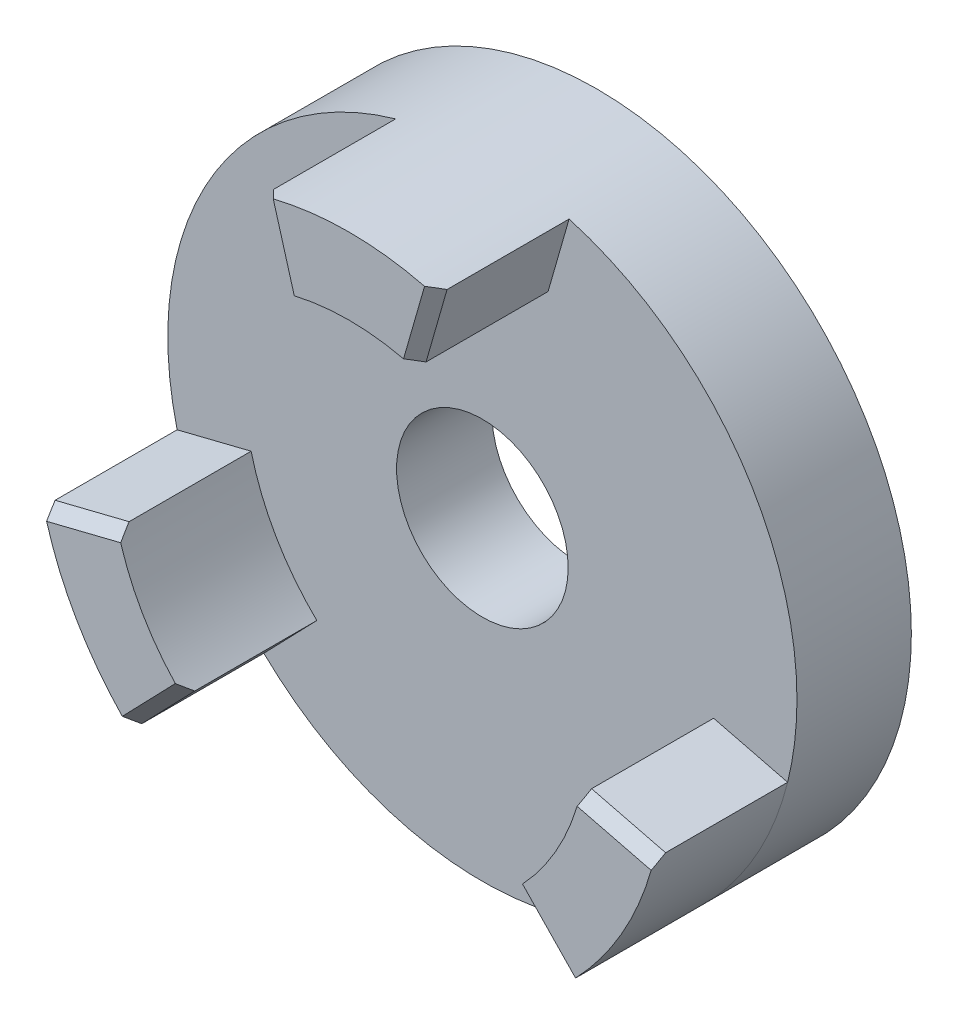
ISO-10303-21;
HEADER;
FILE_DESCRIPTION(('STEP AP214'),'2;1');
FILE_NAME('part.step','',(''),(''),'','','');
FILE_SCHEMA(('AUTOMOTIVE_DESIGN { 1 0 10303 214 1 1 1 1 }'));
ENDSEC;
DATA;
#1=APPLICATION_CONTEXT('core data for automotive mechanical design processes');
#2=APPLICATION_PROTOCOL_DEFINITION('international standard','automotive_design',2000,#1);
#3=PRODUCT_CONTEXT('',#1,'mechanical');
#4=PRODUCT('Part','Part','',(#3));
#5=PRODUCT_RELATED_PRODUCT_CATEGORY('part','',(#4));
#6=PRODUCT_DEFINITION_FORMATION('','',#4);
#7=PRODUCT_DEFINITION_CONTEXT('part definition',#1,'design');
#8=PRODUCT_DEFINITION('design','',#6,#7);
#9=PRODUCT_DEFINITION_SHAPE('','',#8);
#10=(LENGTH_UNIT() NAMED_UNIT(*) SI_UNIT(.MILLI.,.METRE.));
#11=(NAMED_UNIT(*) PLANE_ANGLE_UNIT() SI_UNIT($,.RADIAN.));
#12=(NAMED_UNIT(*) SI_UNIT($,.STERADIAN.) SOLID_ANGLE_UNIT());
#13=UNCERTAINTY_MEASURE_WITH_UNIT(LENGTH_MEASURE(1.E-05),#10,'distance_accuracy_value','');
#14=(GEOMETRIC_REPRESENTATION_CONTEXT(3) GLOBAL_UNCERTAINTY_ASSIGNED_CONTEXT((#13)) GLOBAL_UNIT_ASSIGNED_CONTEXT((#10,
#11,#12)) REPRESENTATION_CONTEXT('',''));
#15=CARTESIAN_POINT('',(0.,0.,0.));
#16=DIRECTION('',(0.,0.,1.));
#17=DIRECTION('',(1.,0.,0.));
#18=AXIS2_PLACEMENT_3D('',#15,#16,#17);
#19=CARTESIAN_POINT('',(0.,0.,1.));
#20=DIRECTION('',(0.,0.,1.));
#21=DIRECTION('',(1.,0.,0.));
#22=AXIS2_PLACEMENT_3D('',#19,#20,#21);
#23=PLANE('',#22);
#24=CARTESIAN_POINT('',(0.,0.,1.));
#25=DIRECTION('',(0.,0.,1.));
#26=DIRECTION('',(1.,0.,0.));
#27=AXIS2_PLACEMENT_3D('',#24,#25,#26);
#28=CIRCLE('',#27,4.5);
#29=CARTESIAN_POINT('',(4.5,0.,1.));
#30=VERTEX_POINT('',#29);
#31=EDGE_CURVE('E669',#30,#30,#28,.T.);
#32=ORIENTED_EDGE('',*,*,#31,.T.);
#33=EDGE_LOOP('',(#32));
#34=FACE_BOUND('',#33,.T.);
#35=CARTESIAN_POINT('',(0.,0.,1.));
#36=DIRECTION('',(0.,0.,1.));
#37=DIRECTION('',(1.,0.,0.));
#38=AXIS2_PLACEMENT_3D('',#35,#36,#37);
#39=CIRCLE('',#38,11.1);
#40=CARTESIAN_POINT('',(11.1,0.,1.));
#41=VERTEX_POINT('',#40);
#42=EDGE_CURVE('E400',#41,#41,#39,.T.);
#43=ORIENTED_EDGE('',*,*,#42,.F.);
#44=EDGE_LOOP('',(#43));
#45=FACE_BOUND('',#44,.T.);
#46=ADVANCED_FACE('F45',(#34,#45),#23,.F.);
#47=CARTESIAN_POINT('',(9.011868826866,-8.396351603367,13.05));
#48=DIRECTION('',(0.508650050796684,0.491197644359695,-0.70710678118656));
#49=DIRECTION('',(0.,-0.82128764305853,-0.570514335805302));
#50=AXIS2_PLACEMENT_3D('',#47,#48,#49);
#51=PLANE('',#50);
#52=CARTESIAN_POINT('',(0.,0.,12.4));
#53=DIRECTION('',(0.508650050796702,0.491197644359712,-0.707106781186535));
#54=DIRECTION('',(-0.508650050796684,-0.491197644359695,-0.70710678118656));
#55=AXIS2_PLACEMENT_3D('',#52,#53,#54);
#56=ELLIPSE('',#55,17.677669529664,12.5);
#57=CARTESIAN_POINT('',(9.104824661985,-8.564588015458,13.));
#58=VERTEX_POINT('',#57);
#59=CARTESIAN_POINT('',(8.683229630737,-8.991747504233,12.4));
#60=VERTEX_POINT('',#59);
#61=EDGE_CURVE('E435',#58,#60,#56,.T.);
#62=ORIENTED_EDGE('',*,*,#61,.T.);
#63=DIRECTION('',(-0.694658370458825,0.719339800338818,0.));
#64=VECTOR('',#63,1.);
#65=CARTESIAN_POINT('',(8.613763793692,-8.919813524199,12.4));
#66=LINE('',#65,#64);
#67=CARTESIAN_POINT('',(11.461863112573,-11.86910670558,12.4));
#68=VERTEX_POINT('',#67);
#69=EDGE_CURVE('E391',#68,#60,#66,.T.);
#70=ORIENTED_EDGE('',*,*,#69,.F.);
#71=CARTESIAN_POINT('',(0.,0.,12.4));
#72=DIRECTION('',(0.508650050796702,0.491197644359712,-0.707106781186535));
#73=DIRECTION('',(-0.508650050796684,-0.491197644359695,-0.70710678118656));
#74=AXIS2_PLACEMENT_3D('',#71,#72,#73);
#75=ELLIPSE('',#74,23.334523779156,16.5);
#76=CARTESIAN_POINT('',(11.885886394651,-11.44446174415,13.));
#77=VERTEX_POINT('',#76);
#78=EDGE_CURVE('E399',#77,#68,#75,.T.);
#79=ORIENTED_EDGE('',*,*,#78,.F.);
#80=DIRECTION('',(-0.694658370458825,0.719339800338818,0.));
#81=VECTOR('',#80,1.);
#82=CARTESIAN_POINT('',(9.492340183085,-8.965872084622,13.));
#83=LINE('',#82,#81);
#84=EDGE_CURVE('E11',#77,#58,#83,.T.);
#85=ORIENTED_EDGE('',*,*,#84,.T.);
#86=EDGE_LOOP('',(#62,#70,#79,#85));
#87=FACE_BOUND('',#86,.T.);
#88=ADVANCED_FACE('F631',(#87),#51,.F.);
#89=CARTESIAN_POINT('',(12.420959014107,-7.171244030388,13.));
#90=DIRECTION('',(0.,0.,1.));
#91=DIRECTION('',(1.,0.,0.));
#92=AXIS2_PLACEMENT_3D('',#89,#90,#91);
#93=PLANE('',#92);
#94=CARTESIAN_POINT('',(0.,0.,13.));
#95=DIRECTION('',(0.,0.,-1.));
#96=DIRECTION('',(0.970295726275919,-0.24192189559998,0.));
#97=AXIS2_PLACEMENT_3D('',#94,#95,#96);
#98=CIRCLE('',#97,12.5);
#99=CARTESIAN_POINT('',(11.969563125326,-3.602715446553,13.));
#100=VERTEX_POINT('',#99);
#101=EDGE_CURVE('E438',#100,#58,#98,.T.);
#102=ORIENTED_EDGE('',*,*,#101,.T.);
#103=ORIENTED_EDGE('',*,*,#84,.F.);
#104=CARTESIAN_POINT('',(-1.234568003383E-13,0.,13.));
#105=DIRECTION('',(0.,0.,1.));
#106=DIRECTION('',(0.694658370458824,-0.719339800338818,0.));
#107=AXIS2_PLACEMENT_3D('',#104,#105,#106);
#108=CIRCLE('',#107,16.5);
#109=CARTESIAN_POINT('',(15.854137800404,-4.571248692185,13.));
#110=VERTEX_POINT('',#109);
#111=EDGE_CURVE('E396',#77,#110,#108,.T.);
#112=ORIENTED_EDGE('',*,*,#111,.T.);
#113=DIRECTION('',(-0.970295726275919,0.24192189559998,0.));
#114=VECTOR('',#113,1.);
#115=CARTESIAN_POINT('',(12.510843083907,-3.737671697605,13.));
#116=LINE('',#115,#114);
#117=EDGE_CURVE('E53',#110,#100,#116,.T.);
#118=ORIENTED_EDGE('',*,*,#117,.T.);
#119=EDGE_LOOP('',(#102,#103,#112,#118));
#120=FACE_BOUND('',#119,.T.);
#121=ADVANCED_FACE('F536',(#120),#93,.T.);
#122=CARTESIAN_POINT('',(11.777388201055,-3.606331537955,13.05));
#123=DIRECTION('',(0.171064612895956,0.686102687805823,0.707106781186818));
#124=DIRECTION('',(0.970295726275999,-0.241921895599656,0.));
#125=AXIS2_PLACEMENT_3D('',#122,#123,#124);
#126=PLANE('',#125);
#127=ORIENTED_EDGE('',*,*,#117,.F.);
#128=CARTESIAN_POINT('',(0.,0.,12.4));
#129=DIRECTION('',(0.171064612896086,0.686102687806347,0.707106781186278));
#130=DIRECTION('',(0.171064612895956,0.686102687805823,-0.707106781186818));
#131=AXIS2_PLACEMENT_3D('',#128,#129,#130);
#132=ELLIPSE('',#131,23.334523779156,16.5);
#133=CARTESIAN_POINT('',(16.009879483554,-3.991711277395,12.4));
#134=VERTEX_POINT('',#133);
#135=EDGE_CURVE('E385',#110,#134,#132,.T.);
#136=ORIENTED_EDGE('',*,*,#135,.T.);
#137=DIRECTION('',(-0.970295726275919,0.24192189559998,0.));
#138=VECTOR('',#137,1.);
#139=CARTESIAN_POINT('',(13.972258458374,-3.483675296635,12.4));
#140=LINE('',#139,#138);
#141=CARTESIAN_POINT('',(12.12869657845,-3.024023694996,12.4));
#142=VERTEX_POINT('',#141);
#143=EDGE_CURVE('E387',#134,#142,#140,.T.);
#144=ORIENTED_EDGE('',*,*,#143,.T.);
#145=CARTESIAN_POINT('',(0.,0.,12.4));
#146=DIRECTION('',(0.171064612896086,0.686102687806347,0.707106781186278));
#147=DIRECTION('',(0.171064612895956,0.686102687805823,-0.707106781186818));
#148=AXIS2_PLACEMENT_3D('',#145,#146,#147);
#149=ELLIPSE('',#148,17.677669529664,12.5);
#150=EDGE_CURVE('E441',#100,#142,#149,.T.);
#151=ORIENTED_EDGE('',*,*,#150,.F.);
#152=EDGE_LOOP('',(#127,#136,#144,#151));
#153=FACE_BOUND('',#152,.T.);
#154=ADVANCED_FACE('F531',(#153),#126,.T.);
#155=CARTESIAN_POINT('',(-9.011868826866,-8.396351603367,13.05));
#156=DIRECTION('',(0.508650050796684,-0.491197644359695,0.70710678118656));
#157=DIRECTION('',(-0.694658370459209,-0.719339800338447,0.));
#158=AXIS2_PLACEMENT_3D('',#155,#156,#157);
#159=PLANE('',#158);
#160=DIRECTION('',(0.694658370458825,0.719339800338818,0.));
#161=VECTOR('',#160,1.);
#162=CARTESIAN_POINT('',(-9.492340183085,-8.965872084622,13.));
#163=LINE('',#162,#161);
#164=CARTESIAN_POINT('',(-11.88588639465,-11.44446174415,13.));
#165=VERTEX_POINT('',#164);
#166=CARTESIAN_POINT('',(-9.104824661985,-8.564588015458,13.));
#167=VERTEX_POINT('',#166);
#168=EDGE_CURVE('E447',#165,#167,#163,.T.);
#169=ORIENTED_EDGE('',*,*,#168,.F.);
#170=CARTESIAN_POINT('',(0.,0.,12.4));
#171=DIRECTION('',(0.508650050796702,-0.491197644359712,0.707106781186535));
#172=DIRECTION('',(0.508650050796684,-0.491197644359695,-0.70710678118656));
#173=AXIS2_PLACEMENT_3D('',#170,#171,#172);
#174=ELLIPSE('',#173,23.334523779156,16.5);
#175=CARTESIAN_POINT('',(-11.46186311257,-11.86910670558,12.4));
#176=VERTEX_POINT('',#175);
#177=EDGE_CURVE('E303',#165,#176,#174,.T.);
#178=ORIENTED_EDGE('',*,*,#177,.T.);
#179=DIRECTION('',(0.694658370458825,0.719339800338818,0.));
#180=VECTOR('',#179,1.);
#181=CARTESIAN_POINT('',(-10.00308053461,-10.35849312487,12.4));
#182=LINE('',#181,#180);
#183=CARTESIAN_POINT('',(-8.683229630737,-8.991747504233,12.4));
#184=VERTEX_POINT('',#183);
#185=EDGE_CURVE('E422',#176,#184,#182,.T.);
#186=ORIENTED_EDGE('',*,*,#185,.T.);
#187=CARTESIAN_POINT('',(0.,0.,12.4));
#188=DIRECTION('',(0.508650050796702,-0.491197644359712,0.707106781186535));
#189=DIRECTION('',(0.508650050796684,-0.491197644359695,-0.70710678118656));
#190=AXIS2_PLACEMENT_3D('',#187,#188,#189);
#191=ELLIPSE('',#190,17.677669529664,12.5);
#192=EDGE_CURVE('E346',#167,#184,#191,.T.);
#193=ORIENTED_EDGE('',*,*,#192,.F.);
#194=EDGE_LOOP('',(#169,#178,#186,#193));
#195=FACE_BOUND('',#194,.T.);
#196=ADVANCED_FACE('F535',(#195),#159,.T.);
#197=CARTESIAN_POINT('',(-12.4209590141,-7.171244030388,13.));
#198=DIRECTION('',(0.,0.,1.));
#199=DIRECTION('',(1.,0.,0.));
#200=AXIS2_PLACEMENT_3D('',#197,#198,#199);
#201=PLANE('',#200);
#202=CARTESIAN_POINT('',(0.,0.,13.));
#203=DIRECTION('',(0.,0.,-1.));
#204=DIRECTION('',(-0.694658370458824,-0.719339800338818,0.));
#205=AXIS2_PLACEMENT_3D('',#202,#203,#204);
#206=CIRCLE('',#205,12.5);
#207=CARTESIAN_POINT('',(-11.96956312532,-3.602715446553,13.));
#208=VERTEX_POINT('',#207);
#209=EDGE_CURVE('E342',#167,#208,#206,.T.);
#210=ORIENTED_EDGE('',*,*,#209,.T.);
#211=DIRECTION('',(0.970295726275919,0.24192189559998,0.));
#212=VECTOR('',#211,1.);
#213=CARTESIAN_POINT('',(-12.5108430839,-3.737671697605,13.));
#214=LINE('',#213,#212);
#215=CARTESIAN_POINT('',(-15.8541378004,-4.571248692185,13.));
#216=VERTEX_POINT('',#215);
#217=EDGE_CURVE('E444',#216,#208,#214,.T.);
#218=ORIENTED_EDGE('',*,*,#217,.F.);
#219=CARTESIAN_POINT('',(0.,0.,13.));
#220=DIRECTION('',(0.,0.,1.));
#221=DIRECTION('',(-0.970295726275919,-0.24192189559998,0.));
#222=AXIS2_PLACEMENT_3D('',#219,#220,#221);
#223=CIRCLE('',#222,16.5);
#224=EDGE_CURVE('E307',#216,#165,#223,.T.);
#225=ORIENTED_EDGE('',*,*,#224,.T.);
#226=ORIENTED_EDGE('',*,*,#168,.T.);
#227=EDGE_LOOP('',(#210,#218,#225,#226));
#228=FACE_BOUND('',#227,.T.);
#229=ADVANCED_FACE('F609',(#228),#201,.T.);
#230=CARTESIAN_POINT('',(-11.77738820105,-3.606331537955,13.05));
#231=DIRECTION('',(0.171064612895956,-0.686102687805823,-0.707106781186818));
#232=DIRECTION('',(0.,-0.71768560148702,0.696367271932143));
#233=AXIS2_PLACEMENT_3D('',#230,#231,#232);
#234=PLANE('',#233);
#235=CARTESIAN_POINT('',(0.,0.,12.4));
#236=DIRECTION('',(0.171064612896086,-0.686102687806347,-0.707106781186278));
#237=DIRECTION('',(-0.171064612895956,0.686102687805823,-0.707106781186818));
#238=AXIS2_PLACEMENT_3D('',#235,#236,#237);
#239=ELLIPSE('',#238,17.677669529664,12.5);
#240=CARTESIAN_POINT('',(-12.12869657845,-3.024023694996,12.4));
#241=VERTEX_POINT('',#240);
#242=EDGE_CURVE('E347',#208,#241,#239,.T.);
#243=ORIENTED_EDGE('',*,*,#242,.T.);
#244=DIRECTION('',(0.970295726275919,0.24192189559998,0.));
#245=VECTOR('',#244,1.);
#246=CARTESIAN_POINT('',(-12.03166700582,-2.999831505436,12.4));
#247=LINE('',#246,#245);
#248=CARTESIAN_POINT('',(-16.00987948355,-3.991711277395,12.4));
#249=VERTEX_POINT('',#248);
#250=EDGE_CURVE('E403',#249,#241,#247,.T.);
#251=ORIENTED_EDGE('',*,*,#250,.F.);
#252=CARTESIAN_POINT('',(0.,0.,12.4));
#253=DIRECTION('',(0.171064612896086,-0.686102687806347,-0.707106781186278));
#254=DIRECTION('',(-0.171064612895956,0.686102687805823,-0.707106781186818));
#255=AXIS2_PLACEMENT_3D('',#252,#253,#254);
#256=ELLIPSE('',#255,23.334523779156,16.5);
#257=EDGE_CURVE('E234',#216,#249,#256,.T.);
#258=ORIENTED_EDGE('',*,*,#257,.F.);
#259=ORIENTED_EDGE('',*,*,#217,.T.);
#260=EDGE_LOOP('',(#243,#251,#258,#259));
#261=FACE_BOUND('',#260,.T.);
#262=ADVANCED_FACE('F601',(#261),#234,.F.);
#263=CARTESIAN_POINT('',(0.,0.,6.));
#264=DIRECTION('',(0.,0.,-1.));
#265=DIRECTION('',(0.970295726275919,-0.24192189559998,0.));
#266=AXIS2_PLACEMENT_3D('',#263,#264,#265);
#267=CYLINDRICAL_SURFACE('',#266,12.5);
#268=DIRECTION('',(0.,0.,1.));
#269=VECTOR('',#268,1.);
#270=CARTESIAN_POINT('',(8.683229630737,-8.991747504233,6.));
#271=LINE('',#270,#269);
#272=CARTESIAN_POINT('',(8.683229630737,-8.991747504233,6.));
#273=VERTEX_POINT('',#272);
#274=EDGE_CURVE('E431',#273,#60,#271,.T.);
#275=ORIENTED_EDGE('',*,*,#274,.T.);
#276=ORIENTED_EDGE('',*,*,#61,.F.);
#277=ORIENTED_EDGE('',*,*,#101,.F.);
#278=ORIENTED_EDGE('',*,*,#150,.T.);
#279=DIRECTION('',(0.,0.,1.));
#280=VECTOR('',#279,1.);
#281=CARTESIAN_POINT('',(12.12869657845,-3.024023694996,6.));
#282=LINE('',#281,#280);
#283=CARTESIAN_POINT('',(12.12869657845,-3.024023694996,6.));
#284=VERTEX_POINT('',#283);
#285=EDGE_CURVE('E392',#284,#142,#282,.T.);
#286=ORIENTED_EDGE('',*,*,#285,.F.);
#287=CARTESIAN_POINT('',(0.,0.,6.));
#288=DIRECTION('',(0.,0.,-1.));
#289=DIRECTION('',(0.970295726275919,-0.24192189559998,0.));
#290=AXIS2_PLACEMENT_3D('',#287,#288,#289);
#291=CIRCLE('',#290,12.5);
#292=EDGE_CURVE('E332',#284,#273,#291,.T.);
#293=ORIENTED_EDGE('',*,*,#292,.T.);
#294=EDGE_LOOP('',(#275,#276,#277,#278,#286,#293));
#295=FACE_BOUND('',#294,.T.);
#296=ADVANCED_FACE('F593',(#295),#267,.F.);
#297=CARTESIAN_POINT('',(8.683229630737,-8.991747504233,6.));
#298=DIRECTION('',(0.719339800338818,0.694658370458825,0.));
#299=DIRECTION('',(0.,0.,-1.));
#300=AXIS2_PLACEMENT_3D('',#297,#298,#299);
#301=PLANE('',#300);
#302=DIRECTION('',(0.,0.,1.));
#303=VECTOR('',#302,1.);
#304=CARTESIAN_POINT('',(11.461863112573,-11.86910670558,6.));
#305=LINE('',#304,#303);
#306=CARTESIAN_POINT('',(11.461863112573,-11.86910670558,6.));
#307=VERTEX_POINT('',#306);
#308=EDGE_CURVE('E408',#307,#68,#305,.T.);
#309=ORIENTED_EDGE('',*,*,#308,.T.);
#310=ORIENTED_EDGE('',*,*,#69,.T.);
#311=ORIENTED_EDGE('',*,*,#274,.F.);
#312=DIRECTION('',(0.694658370458825,-0.719339800338818,0.));
#313=VECTOR('',#312,1.);
#314=CARTESIAN_POINT('',(8.683229630737,-8.991747504233,6.));
#315=LINE('',#314,#313);
#316=EDGE_CURVE('E328',#273,#307,#315,.T.);
#317=ORIENTED_EDGE('',*,*,#316,.T.);
#318=EDGE_LOOP('',(#309,#310,#311,#317));
#319=FACE_BOUND('',#318,.T.);
#320=ADVANCED_FACE('F585',(#319),#301,.F.);
#321=CARTESIAN_POINT('',(16.009879483554,-3.991711277395,6.));
#322=DIRECTION('',(-0.24192189559998,-0.970295726275919,0.));
#323=DIRECTION('',(-0.970295726275919,0.24192189559998,0.));
#324=AXIS2_PLACEMENT_3D('',#321,#322,#323);
#325=PLANE('',#324);
#326=ORIENTED_EDGE('',*,*,#285,.T.);
#327=ORIENTED_EDGE('',*,*,#143,.F.);
#328=DIRECTION('',(0.,0.,1.));
#329=VECTOR('',#328,1.);
#330=CARTESIAN_POINT('',(16.009879483554,-3.991711277395,6.));
#331=LINE('',#330,#329);
#332=CARTESIAN_POINT('',(16.009879483554,-3.991711277395,6.));
#333=VERTEX_POINT('',#332);
#334=EDGE_CURVE('E238',#333,#134,#331,.T.);
#335=ORIENTED_EDGE('',*,*,#334,.F.);
#336=DIRECTION('',(-0.970295726275919,0.24192189559998,0.));
#337=VECTOR('',#336,1.);
#338=CARTESIAN_POINT('',(16.009879483554,-3.991711277395,6.));
#339=LINE('',#338,#337);
#340=EDGE_CURVE('E318',#333,#284,#339,.T.);
#341=ORIENTED_EDGE('',*,*,#340,.T.);
#342=EDGE_LOOP('',(#326,#327,#335,#341));
#343=FACE_BOUND('',#342,.T.);
#344=ADVANCED_FACE('F494',(#343),#325,.F.);
#345=CARTESIAN_POINT('',(-11.46186311257,-11.86910670558,6.));
#346=DIRECTION('',(-0.719339800338818,0.694658370458825,0.));
#347=DIRECTION('',(0.,0.,1.));
#348=AXIS2_PLACEMENT_3D('',#345,#346,#347);
#349=PLANE('',#348);
#350=DIRECTION('',(0.,0.,1.));
#351=VECTOR('',#350,1.);
#352=CARTESIAN_POINT('',(-8.683229630737,-8.991747504233,6.));
#353=LINE('',#352,#351);
#354=CARTESIAN_POINT('',(-8.683229630737,-8.991747504233,6.));
#355=VERTEX_POINT('',#354);
#356=EDGE_CURVE('E421',#355,#184,#353,.T.);
#357=ORIENTED_EDGE('',*,*,#356,.T.);
#358=ORIENTED_EDGE('',*,*,#185,.F.);
#359=DIRECTION('',(0.,0.,1.));
#360=VECTOR('',#359,1.);
#361=CARTESIAN_POINT('',(-11.46186311257,-11.86910670558,6.));
#362=LINE('',#361,#360);
#363=CARTESIAN_POINT('',(-11.46186311257,-11.86910670558,6.));
#364=VERTEX_POINT('',#363);
#365=EDGE_CURVE('E308',#364,#176,#362,.T.);
#366=ORIENTED_EDGE('',*,*,#365,.F.);
#367=DIRECTION('',(0.694658370458825,0.719339800338818,0.));
#368=VECTOR('',#367,1.);
#369=CARTESIAN_POINT('',(-11.46186311257,-11.86910670558,6.));
#370=LINE('',#369,#368);
#371=EDGE_CURVE('E324',#364,#355,#370,.T.);
#372=ORIENTED_EDGE('',*,*,#371,.T.);
#373=EDGE_LOOP('',(#357,#358,#366,#372));
#374=FACE_BOUND('',#373,.T.);
#375=ADVANCED_FACE('F489',(#374),#349,.F.);
#376=CARTESIAN_POINT('',(0.,0.,6.));
#377=DIRECTION('',(0.,0.,-1.));
#378=DIRECTION('',(-0.694658370458825,-0.719339800338818,0.));
#379=AXIS2_PLACEMENT_3D('',#376,#377,#378);
#380=CYLINDRICAL_SURFACE('',#379,12.5);
#381=DIRECTION('',(0.,0.,1.));
#382=VECTOR('',#381,1.);
#383=CARTESIAN_POINT('',(-12.12869657845,-3.024023694996,6.));
#384=LINE('',#383,#382);
#385=CARTESIAN_POINT('',(-12.12869657845,-3.024023694996,6.));
#386=VERTEX_POINT('',#385);
#387=EDGE_CURVE('E245',#386,#241,#384,.T.);
#388=ORIENTED_EDGE('',*,*,#387,.T.);
#389=ORIENTED_EDGE('',*,*,#242,.F.);
#390=ORIENTED_EDGE('',*,*,#209,.F.);
#391=ORIENTED_EDGE('',*,*,#192,.T.);
#392=ORIENTED_EDGE('',*,*,#356,.F.);
#393=CARTESIAN_POINT('',(0.,0.,6.));
#394=DIRECTION('',(0.,0.,-1.));
#395=DIRECTION('',(-0.694658370458824,-0.719339800338818,0.));
#396=AXIS2_PLACEMENT_3D('',#393,#394,#395);
#397=CIRCLE('',#396,12.5);
#398=EDGE_CURVE('E250',#355,#386,#397,.T.);
#399=ORIENTED_EDGE('',*,*,#398,.T.);
#400=EDGE_LOOP('',(#388,#389,#390,#391,#392,#399));
#401=FACE_BOUND('',#400,.T.);
#402=ADVANCED_FACE('F493',(#401),#380,.F.);
#403=CARTESIAN_POINT('',(-12.12869657845,-3.024023694996,6.));
#404=DIRECTION('',(0.24192189559998,-0.970295726275919,0.));
#405=DIRECTION('',(0.,0.,-1.));
#406=AXIS2_PLACEMENT_3D('',#403,#404,#405);
#407=PLANE('',#406);
#408=DIRECTION('',(0.,0.,1.));
#409=VECTOR('',#408,1.);
#410=CARTESIAN_POINT('',(-16.00987948355,-3.991711277395,6.));
#411=LINE('',#410,#409);
#412=CARTESIAN_POINT('',(-16.00987948355,-3.991711277395,6.));
#413=VERTEX_POINT('',#412);
#414=EDGE_CURVE('E225',#413,#249,#411,.T.);
#415=ORIENTED_EDGE('',*,*,#414,.T.);
#416=ORIENTED_EDGE('',*,*,#250,.T.);
#417=ORIENTED_EDGE('',*,*,#387,.F.);
#418=DIRECTION('',(-0.970295726275919,-0.24192189559998,0.));
#419=VECTOR('',#418,1.);
#420=CARTESIAN_POINT('',(-12.12869657845,-3.024023694996,6.));
#421=LINE('',#420,#419);
#422=EDGE_CURVE('E241',#386,#413,#421,.T.);
#423=ORIENTED_EDGE('',*,*,#422,.T.);
#424=EDGE_LOOP('',(#415,#416,#417,#423));
#425=FACE_BOUND('',#424,.T.);
#426=ADVANCED_FACE('F243',(#425),#407,.F.);
#427=CARTESIAN_POINT('',(0.,0.,6.));
#428=DIRECTION('',(0.,0.,-1.));
#429=DIRECTION('',(-0.275637355817084,0.961261695938294,0.));
#430=AXIS2_PLACEMENT_3D('',#427,#428,#429);
#431=CYLINDRICAL_SURFACE('',#430,12.5);
#432=DIRECTION('',(0.,0.,1.));
#433=VECTOR('',#432,1.);
#434=CARTESIAN_POINT('',(3.445466947712,12.015771199229,6.));
#435=LINE('',#434,#433);
#436=CARTESIAN_POINT('',(3.445466947712,12.015771199229,6.));
#437=VERTEX_POINT('',#436);
#438=CARTESIAN_POINT('',(3.445466947712,12.015771199229,12.4));
#439=VERTEX_POINT('',#438);
#440=EDGE_CURVE('E293',#437,#439,#435,.T.);
#441=ORIENTED_EDGE('',*,*,#440,.T.);
#442=CARTESIAN_POINT('',(0.,0.,12.4));
#443=DIRECTION('',(-0.679714663692845,0.194905043446956,-0.70710678118645));
#444=DIRECTION('',(0.679714663692658,-0.194905043446902,-0.707106781186645));
#445=AXIS2_PLACEMENT_3D('',#442,#443,#444);
#446=ELLIPSE('',#445,17.677669529664,12.5);
#447=CARTESIAN_POINT('',(2.864738463342,12.16730346201,13.));
#448=VERTEX_POINT('',#447);
#449=EDGE_CURVE('E353',#448,#439,#446,.T.);
#450=ORIENTED_EDGE('',*,*,#449,.F.);
#451=CARTESIAN_POINT('',(0.,0.,13.));
#452=DIRECTION('',(0.,0.,-1.));
#453=DIRECTION('',(-0.275637355817084,0.961261695938294,0.));
#454=AXIS2_PLACEMENT_3D('',#451,#452,#453);
#455=CIRCLE('',#454,12.5);
#456=CARTESIAN_POINT('',(-2.864738463342,12.16730346201,13.));
#457=VERTEX_POINT('',#456);
#458=EDGE_CURVE('E352',#457,#448,#455,.T.);
#459=ORIENTED_EDGE('',*,*,#458,.F.);
#460=CARTESIAN_POINT('',(0.,0.,12.4));
#461=DIRECTION('',(-0.679714663692845,-0.194905043446956,0.70710678118645));
#462=DIRECTION('',(-0.679714663692658,-0.194905043446902,-0.707106781186645));
#463=AXIS2_PLACEMENT_3D('',#460,#461,#462);
#464=ELLIPSE('',#463,17.677669529664,12.5);
#465=CARTESIAN_POINT('',(-3.445466947712,12.015771199229,12.4));
#466=VERTEX_POINT('',#465);
#467=EDGE_CURVE('E369',#457,#466,#464,.T.);
#468=ORIENTED_EDGE('',*,*,#467,.T.);
#469=DIRECTION('',(0.,0.,1.));
#470=VECTOR('',#469,1.);
#471=CARTESIAN_POINT('',(-3.445466947712,12.015771199229,6.));
#472=LINE('',#471,#470);
#473=CARTESIAN_POINT('',(-3.445466947712,12.015771199229,6.));
#474=VERTEX_POINT('',#473);
#475=EDGE_CURVE('E373',#474,#466,#472,.T.);
#476=ORIENTED_EDGE('',*,*,#475,.F.);
#477=CARTESIAN_POINT('',(0.,0.,6.));
#478=DIRECTION('',(0.,0.,-1.));
#479=DIRECTION('',(-0.275637355817084,0.961261695938294,0.));
#480=AXIS2_PLACEMENT_3D('',#477,#478,#479);
#481=CIRCLE('',#480,12.5);
#482=EDGE_CURVE('E294',#474,#437,#481,.T.);
#483=ORIENTED_EDGE('',*,*,#482,.T.);
#484=EDGE_LOOP('',(#441,#450,#459,#468,#476,#483));
#485=FACE_BOUND('',#484,.T.);
#486=ADVANCED_FACE('F481',(#485),#431,.F.);
#487=CARTESIAN_POINT('',(0.,0.,0.));
#488=DIRECTION('',(0.,0.,-1.));
#489=DIRECTION('',(1.,0.,0.));
#490=AXIS2_PLACEMENT_3D('',#487,#488,#489);
#491=CYLINDRICAL_SURFACE('',#490,11.1);
#492=DIRECTION('',(0.,0.,1.));
#493=VECTOR('',#492,1.);
#494=CARTESIAN_POINT('',(11.1,0.,0.));
#495=LINE('',#494,#493);
#496=CARTESIAN_POINT('',(11.1,0.,0.));
#497=VERTEX_POINT('',#496);
#498=EDGE_CURVE('E404',#497,#41,#495,.T.);
#499=ORIENTED_EDGE('',*,*,#498,.T.);
#500=ORIENTED_EDGE('',*,*,#42,.T.);
#501=ORIENTED_EDGE('',*,*,#498,.F.);
#502=CARTESIAN_POINT('',(0.,0.,0.));
#503=DIRECTION('',(0.,0.,1.));
#504=DIRECTION('',(1.,0.,0.));
#505=AXIS2_PLACEMENT_3D('',#502,#503,#504);
#506=CIRCLE('',#505,11.1);
#507=EDGE_CURVE('E298',#497,#497,#506,.T.);
#508=ORIENTED_EDGE('',*,*,#507,.F.);
#509=EDGE_LOOP('',(#499,#500,#501,#508));
#510=FACE_BOUND('',#509,.T.);
#511=ADVANCED_FACE('F484',(#510),#491,.F.);
#512=CARTESIAN_POINT('',(0.,0.,0.));
#513=DIRECTION('',(0.,0.,-1.));
#514=DIRECTION('',(1.,0.,0.));
#515=AXIS2_PLACEMENT_3D('',#512,#513,#514);
#516=CYLINDRICAL_SURFACE('',#515,16.5);
#517=CARTESIAN_POINT('',(-1.234568003383E-13,0.,6.));
#518=DIRECTION('',(0.,0.,1.));
#519=DIRECTION('',(0.694658370458824,-0.719339800338818,0.));
#520=AXIS2_PLACEMENT_3D('',#517,#518,#519);
#521=CIRCLE('',#520,16.5);
#522=EDGE_CURVE('E274',#307,#333,#521,.T.);
#523=ORIENTED_EDGE('',*,*,#522,.T.);
#524=ORIENTED_EDGE('',*,*,#334,.T.);
#525=ORIENTED_EDGE('',*,*,#135,.F.);
#526=ORIENTED_EDGE('',*,*,#111,.F.);
#527=ORIENTED_EDGE('',*,*,#78,.T.);
#528=ORIENTED_EDGE('',*,*,#308,.F.);
#529=EDGE_LOOP('',(#523,#524,#525,#526,#527,#528));
#530=FACE_BOUND('',#529,.T.);
#531=ADVANCED_FACE('F551',(#530),#516,.T.);
#532=CARTESIAN_POINT('',(0.,0.,0.));
#533=DIRECTION('',(0.,0.,-1.));
#534=DIRECTION('',(1.,0.,0.));
#535=AXIS2_PLACEMENT_3D('',#532,#533,#534);
#536=CYLINDRICAL_SURFACE('',#535,16.5);
#537=CARTESIAN_POINT('',(0.,0.,6.));
#538=DIRECTION('',(0.,0.,1.));
#539=DIRECTION('',(-0.970295726275919,-0.24192189559998,0.));
#540=AXIS2_PLACEMENT_3D('',#537,#538,#539);
#541=CIRCLE('',#540,16.5);
#542=EDGE_CURVE('E230',#413,#364,#541,.T.);
#543=ORIENTED_EDGE('',*,*,#542,.T.);
#544=ORIENTED_EDGE('',*,*,#365,.T.);
#545=ORIENTED_EDGE('',*,*,#177,.F.);
#546=ORIENTED_EDGE('',*,*,#224,.F.);
#547=ORIENTED_EDGE('',*,*,#257,.T.);
#548=ORIENTED_EDGE('',*,*,#414,.F.);
#549=EDGE_LOOP('',(#543,#544,#545,#546,#547,#548));
#550=FACE_BOUND('',#549,.T.);
#551=ADVANCED_FACE('F227',(#550),#536,.T.);
#552=CARTESIAN_POINT('',(-4.54801637098,15.860817982982,6.));
#553=DIRECTION('',(0.961261695938294,0.275637355817084,0.));
#554=DIRECTION('',(0.,0.,-1.));
#555=AXIS2_PLACEMENT_3D('',#552,#553,#554);
#556=PLANE('',#555);
#557=ORIENTED_EDGE('',*,*,#475,.T.);
#558=DIRECTION('',(0.275637355817084,-0.961261695938294,0.));
#559=VECTOR('',#558,1.);
#560=CARTESIAN_POINT('',(-3.969177923765,13.842168421512,12.4));
#561=LINE('',#560,#559);
#562=CARTESIAN_POINT('',(-4.54801637098,15.860817982982,12.4));
#563=VERTEX_POINT('',#562);
#564=EDGE_CURVE('E365',#563,#466,#561,.T.);
#565=ORIENTED_EDGE('',*,*,#564,.F.);
#566=DIRECTION('',(0.,0.,1.));
#567=VECTOR('',#566,1.);
#568=CARTESIAN_POINT('',(-4.54801637098,15.860817982982,6.));
#569=LINE('',#568,#567);
#570=CARTESIAN_POINT('',(-4.54801637098,15.860817982982,6.));
#571=VERTEX_POINT('',#570);
#572=EDGE_CURVE('E262',#571,#563,#569,.T.);
#573=ORIENTED_EDGE('',*,*,#572,.F.);
#574=DIRECTION('',(0.275637355817084,-0.961261695938294,0.));
#575=VECTOR('',#574,1.);
#576=CARTESIAN_POINT('',(-4.54801637098,15.860817982982,6.));
#577=LINE('',#576,#575);
#578=EDGE_CURVE('E251',#571,#474,#577,.T.);
#579=ORIENTED_EDGE('',*,*,#578,.T.);
#580=EDGE_LOOP('',(#557,#565,#573,#579));
#581=FACE_BOUND('',#580,.T.);
#582=ADVANCED_FACE('F507',(#581),#556,.F.);
#583=CARTESIAN_POINT('',(-2.765519374189,12.002683141322,13.05));
#584=DIRECTION('',(-0.679714663692659,-0.194905043446902,0.707106781186645));
#585=DIRECTION('',(-0.275637355817564,0.961261695938157,0.));
#586=AXIS2_PLACEMENT_3D('',#583,#584,#585);
#587=PLANE('',#586);
#588=DIRECTION('',(0.275637355817084,-0.961261695938294,0.));
#589=VECTOR('',#588,1.);
#590=CARTESIAN_POINT('',(-3.018502900822,12.703543782227,13.));
#591=LINE('',#590,#589);
#592=CARTESIAN_POINT('',(-3.968251405753,16.015710436342,13.));
#593=VERTEX_POINT('',#592);
#594=EDGE_CURVE('E361',#593,#457,#591,.T.);
#595=ORIENTED_EDGE('',*,*,#594,.F.);
#596=CARTESIAN_POINT('',(0.,0.,12.4));
#597=DIRECTION('',(-0.679714663692845,-0.194905043446956,0.70710678118645));
#598=DIRECTION('',(-0.679714663692659,-0.194905043446902,-0.707106781186645));
#599=AXIS2_PLACEMENT_3D('',#596,#597,#598);
#600=ELLIPSE('',#599,23.334523779156,16.5);
#601=EDGE_CURVE('E283',#593,#563,#600,.T.);
#602=ORIENTED_EDGE('',*,*,#601,.T.);
#603=ORIENTED_EDGE('',*,*,#564,.T.);
#604=ORIENTED_EDGE('',*,*,#467,.F.);
#605=EDGE_LOOP('',(#595,#602,#603,#604));
#606=FACE_BOUND('',#605,.T.);
#607=ADVANCED_FACE('F511',(#606),#587,.T.);
#608=CARTESIAN_POINT('',(0.,14.342488060776,13.));
#609=DIRECTION('',(0.,0.,1.));
#610=DIRECTION('',(1.,0.,0.));
#611=AXIS2_PLACEMENT_3D('',#608,#609,#610);
#612=PLANE('',#611);
#613=ORIENTED_EDGE('',*,*,#458,.T.);
#614=DIRECTION('',(-0.275637355817084,-0.961261695938294,0.));
#615=VECTOR('',#614,1.);
#616=CARTESIAN_POINT('',(3.018502900822,12.703543782227,13.));
#617=LINE('',#616,#615);
#618=CARTESIAN_POINT('',(3.968251405753,16.015710436342,13.));
#619=VERTEX_POINT('',#618);
#620=EDGE_CURVE('E348',#619,#448,#617,.T.);
#621=ORIENTED_EDGE('',*,*,#620,.F.);
#622=CARTESIAN_POINT('',(0.,0.,13.));
#623=DIRECTION('',(0.,0.,1.));
#624=DIRECTION('',(0.275637355817084,0.961261695938294,0.));
#625=AXIS2_PLACEMENT_3D('',#622,#623,#624);
#626=CIRCLE('',#625,16.5);
#627=EDGE_CURVE('E282',#619,#593,#626,.T.);
#628=ORIENTED_EDGE('',*,*,#627,.T.);
#629=ORIENTED_EDGE('',*,*,#594,.T.);
#630=EDGE_LOOP('',(#613,#621,#628,#629));
#631=FACE_BOUND('',#630,.T.);
#632=ADVANCED_FACE('F519',(#631),#612,.T.);
#633=CARTESIAN_POINT('',(2.765519374189,12.002683141322,13.05));
#634=DIRECTION('',(-0.679714663692659,0.194905043446902,-0.707106781186645));
#635=DIRECTION('',(-0.720932745455215,0.,0.693005033553441));
#636=AXIS2_PLACEMENT_3D('',#633,#634,#635);
#637=PLANE('',#636);
#638=ORIENTED_EDGE('',*,*,#449,.T.);
#639=DIRECTION('',(-0.275637355817084,-0.961261695938294,0.));
#640=VECTOR('',#639,1.);
#641=CARTESIAN_POINT('',(3.417903212131,11.919645029635,12.4));
#642=LINE('',#641,#640);
#643=CARTESIAN_POINT('',(4.54801637098,15.860817982982,12.4));
#644=VERTEX_POINT('',#643);
#645=EDGE_CURVE('E289',#644,#439,#642,.T.);
#646=ORIENTED_EDGE('',*,*,#645,.F.);
#647=CARTESIAN_POINT('',(0.,0.,12.4));
#648=DIRECTION('',(-0.679714663692845,0.194905043446956,-0.70710678118645));
#649=DIRECTION('',(0.679714663692659,-0.194905043446902,-0.707106781186645));
#650=AXIS2_PLACEMENT_3D('',#647,#648,#649);
#651=ELLIPSE('',#650,23.334523779156,16.5);
#652=EDGE_CURVE('E278',#619,#644,#651,.T.);
#653=ORIENTED_EDGE('',*,*,#652,.F.);
#654=ORIENTED_EDGE('',*,*,#620,.T.);
#655=EDGE_LOOP('',(#638,#646,#653,#654));
#656=FACE_BOUND('',#655,.T.);
#657=ADVANCED_FACE('F502',(#656),#637,.F.);
#658=CARTESIAN_POINT('',(3.445466947712,12.015771199229,6.));
#659=DIRECTION('',(-0.961261695938294,0.275637355817084,0.));
#660=DIRECTION('',(0.,0.,1.));
#661=AXIS2_PLACEMENT_3D('',#658,#659,#660);
#662=PLANE('',#661);
#663=DIRECTION('',(0.,0.,1.));
#664=VECTOR('',#663,1.);
#665=CARTESIAN_POINT('',(4.54801637098,15.860817982982,6.));
#666=LINE('',#665,#664);
#667=CARTESIAN_POINT('',(4.54801637098,15.860817982982,6.));
#668=VERTEX_POINT('',#667);
#669=EDGE_CURVE('E281',#668,#644,#666,.T.);
#670=ORIENTED_EDGE('',*,*,#669,.T.);
#671=ORIENTED_EDGE('',*,*,#645,.T.);
#672=ORIENTED_EDGE('',*,*,#440,.F.);
#673=DIRECTION('',(0.275637355817084,0.961261695938294,0.));
#674=VECTOR('',#673,1.);
#675=CARTESIAN_POINT('',(3.445466947712,12.015771199229,6.));
#676=LINE('',#675,#674);
#677=EDGE_CURVE('E315',#437,#668,#676,.T.);
#678=ORIENTED_EDGE('',*,*,#677,.T.);
#679=EDGE_LOOP('',(#670,#671,#672,#678));
#680=FACE_BOUND('',#679,.T.);
#681=ADVANCED_FACE('F474',(#680),#662,.F.);
#682=CARTESIAN_POINT('',(0.,0.,6.));
#683=DIRECTION('',(0.,0.,1.));
#684=DIRECTION('',(1.,0.,0.));
#685=AXIS2_PLACEMENT_3D('',#682,#683,#684);
#686=PLANE('',#685);
#687=CARTESIAN_POINT('',(0.,0.,6.));
#688=DIRECTION('',(0.,0.,1.));
#689=DIRECTION('',(1.,0.,0.));
#690=AXIS2_PLACEMENT_3D('',#687,#688,#689);
#691=CIRCLE('',#690,4.5);
#692=CARTESIAN_POINT('',(4.5,0.,6.));
#693=VERTEX_POINT('',#692);
#694=EDGE_CURVE('E672',#693,#693,#691,.T.);
#695=ORIENTED_EDGE('',*,*,#694,.F.);
#696=EDGE_LOOP('',(#695));
#697=FACE_BOUND('',#696,.T.);
#698=ORIENTED_EDGE('',*,*,#578,.F.);
#699=CARTESIAN_POINT('',(0.,0.,6.));
#700=DIRECTION('',(0.,0.,1.));
#701=DIRECTION('',(1.,0.,0.));
#702=AXIS2_PLACEMENT_3D('',#699,#700,#701);
#703=CIRCLE('',#702,16.5);
#704=EDGE_CURVE('E254',#571,#413,#703,.T.);
#705=ORIENTED_EDGE('',*,*,#704,.T.);
#706=ORIENTED_EDGE('',*,*,#422,.F.);
#707=ORIENTED_EDGE('',*,*,#398,.F.);
#708=ORIENTED_EDGE('',*,*,#371,.F.);
#709=CARTESIAN_POINT('',(0.,0.,6.));
#710=DIRECTION('',(0.,0.,1.));
#711=DIRECTION('',(1.,0.,0.));
#712=AXIS2_PLACEMENT_3D('',#709,#710,#711);
#713=CIRCLE('',#712,16.5);
#714=EDGE_CURVE('E268',#364,#307,#713,.T.);
#715=ORIENTED_EDGE('',*,*,#714,.T.);
#716=ORIENTED_EDGE('',*,*,#316,.F.);
#717=ORIENTED_EDGE('',*,*,#292,.F.);
#718=ORIENTED_EDGE('',*,*,#340,.F.);
#719=CARTESIAN_POINT('',(0.,0.,6.));
#720=DIRECTION('',(0.,0.,1.));
#721=DIRECTION('',(1.,0.,0.));
#722=AXIS2_PLACEMENT_3D('',#719,#720,#721);
#723=CIRCLE('',#722,16.5);
#724=CARTESIAN_POINT('',(16.5,0.,6.));
#725=VERTEX_POINT('',#724);
#726=EDGE_CURVE('E683',#333,#725,#723,.T.);
#727=ORIENTED_EDGE('',*,*,#726,.T.);
#728=CARTESIAN_POINT('',(0.,0.,6.));
#729=DIRECTION('',(0.,0.,1.));
#730=DIRECTION('',(1.,0.,0.));
#731=AXIS2_PLACEMENT_3D('',#728,#729,#730);
#732=CIRCLE('',#731,16.5);
#733=EDGE_CURVE('E299',#725,#668,#732,.T.);
#734=ORIENTED_EDGE('',*,*,#733,.T.);
#735=ORIENTED_EDGE('',*,*,#677,.F.);
#736=ORIENTED_EDGE('',*,*,#482,.F.);
#737=EDGE_LOOP('',(#698,#705,#706,#707,#708,#715,#716,#717,#718,#727,#734,#735,#736));
#738=FACE_BOUND('',#737,.T.);
#739=ADVANCED_FACE('F255',(#697,#738),#686,.T.);
#740=CARTESIAN_POINT('',(0.,0.,0.));
#741=DIRECTION('',(0.,0.,1.));
#742=DIRECTION('',(1.,0.,0.));
#743=AXIS2_PLACEMENT_3D('',#740,#741,#742);
#744=PLANE('',#743);
#745=ORIENTED_EDGE('',*,*,#507,.T.);
#746=EDGE_LOOP('',(#745));
#747=FACE_BOUND('',#746,.T.);
#748=CARTESIAN_POINT('',(0.,0.,0.));
#749=DIRECTION('',(0.,0.,1.));
#750=DIRECTION('',(1.,0.,0.));
#751=AXIS2_PLACEMENT_3D('',#748,#749,#750);
#752=CIRCLE('',#751,16.5);
#753=CARTESIAN_POINT('',(16.5,0.,0.));
#754=VERTEX_POINT('',#753);
#755=EDGE_CURVE('E295',#754,#754,#752,.T.);
#756=ORIENTED_EDGE('',*,*,#755,.F.);
#757=EDGE_LOOP('',(#756));
#758=FACE_BOUND('',#757,.T.);
#759=ADVANCED_FACE('F459',(#747,#758),#744,.F.);
#760=CARTESIAN_POINT('',(0.,0.,0.));
#761=DIRECTION('',(0.,0.,-1.));
#762=DIRECTION('',(1.,0.,0.));
#763=AXIS2_PLACEMENT_3D('',#760,#761,#762);
#764=CYLINDRICAL_SURFACE('',#763,16.5);
#765=DIRECTION('',(0.,0.,1.));
#766=VECTOR('',#765,1.);
#767=CARTESIAN_POINT('',(16.5,0.,0.));
#768=LINE('',#767,#766);
#769=EDGE_CURVE('E674',#754,#725,#768,.T.);
#770=ORIENTED_EDGE('',*,*,#769,.T.);
#771=ORIENTED_EDGE('',*,*,#726,.F.);
#772=ORIENTED_EDGE('',*,*,#522,.F.);
#773=ORIENTED_EDGE('',*,*,#714,.F.);
#774=ORIENTED_EDGE('',*,*,#542,.F.);
#775=ORIENTED_EDGE('',*,*,#704,.F.);
#776=ORIENTED_EDGE('',*,*,#572,.T.);
#777=ORIENTED_EDGE('',*,*,#601,.F.);
#778=ORIENTED_EDGE('',*,*,#627,.F.);
#779=ORIENTED_EDGE('',*,*,#652,.T.);
#780=ORIENTED_EDGE('',*,*,#669,.F.);
#781=ORIENTED_EDGE('',*,*,#733,.F.);
#782=ORIENTED_EDGE('',*,*,#769,.F.);
#783=ORIENTED_EDGE('',*,*,#755,.T.);
#784=EDGE_LOOP('',(#770,#771,#772,#773,#774,#775,#776,#777,#778,#779,#780,#781,#782,#783));
#785=FACE_BOUND('',#784,.T.);
#786=ADVANCED_FACE('F265',(#785),#764,.T.);
#787=CARTESIAN_POINT('',(0.,0.,1.));
#788=DIRECTION('',(0.,0.,1.));
#789=DIRECTION('',(1.,0.,0.));
#790=AXIS2_PLACEMENT_3D('',#787,#788,#789);
#791=CYLINDRICAL_SURFACE('',#790,4.5);
#792=ORIENTED_EDGE('',*,*,#31,.F.);
#793=EDGE_LOOP('',(#792));
#794=FACE_BOUND('',#793,.T.);
#795=ORIENTED_EDGE('',*,*,#694,.T.);
#796=EDGE_LOOP('',(#795));
#797=FACE_BOUND('',#796,.T.);
#798=ADVANCED_FACE('F458',(#794,#797),#791,.F.);
#799=CLOSED_SHELL('',(#46,#88,#121,#154,#196,#229,#262,#296,#320,#344,#375,#402,#426,#486,#511,
#531,#551,#582,#607,#632,#657,#681,#739,#759,#786,#798));
#800=MANIFOLD_SOLID_BREP('B2',#799);
#801=ADVANCED_BREP_SHAPE_REPRESENTATION('',(#18,#800),#14);
#802=SHAPE_DEFINITION_REPRESENTATION(#9,#801);
ENDSEC;
END-ISO-10303-21;
